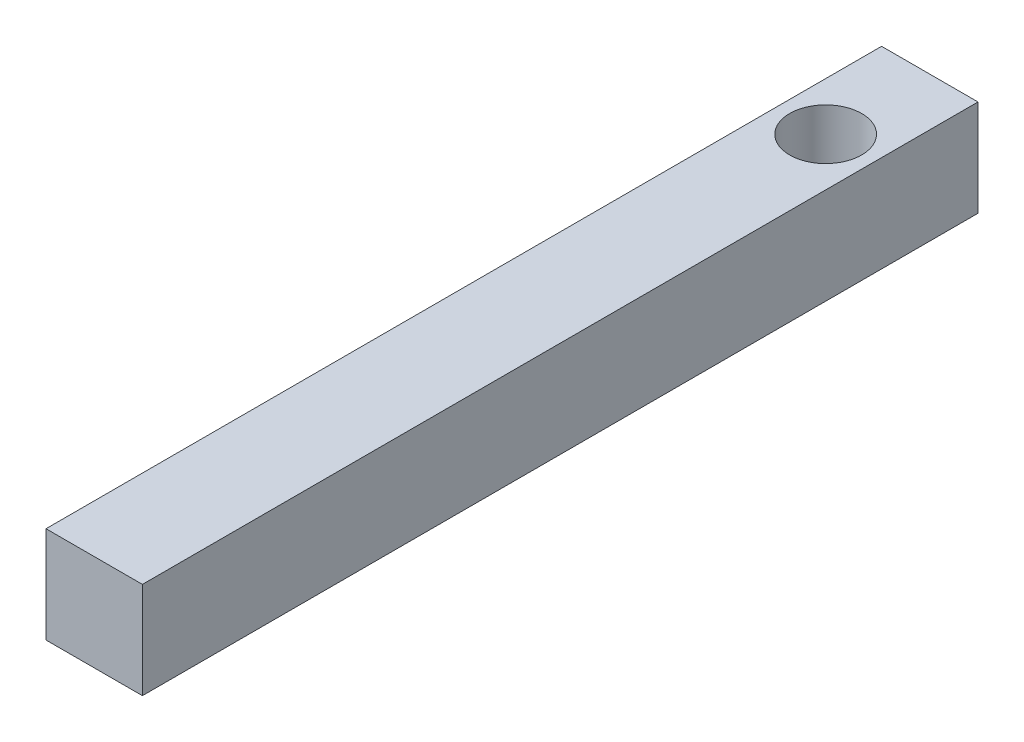
ISO-10303-21;
HEADER;
FILE_DESCRIPTION(('STEP AP214'),'2;1');
FILE_NAME('part.step','',(''),(''),'','','');
FILE_SCHEMA(('AUTOMOTIVE_DESIGN { 1 0 10303 214 1 1 1 1 }'));
ENDSEC;
DATA;
#1=APPLICATION_CONTEXT('core data for automotive mechanical design processes');
#2=APPLICATION_PROTOCOL_DEFINITION('international standard','automotive_design',2000,#1);
#3=PRODUCT_CONTEXT('',#1,'mechanical');
#4=PRODUCT('Part','Part','',(#3));
#5=PRODUCT_RELATED_PRODUCT_CATEGORY('part','',(#4));
#6=PRODUCT_DEFINITION_FORMATION('','',#4);
#7=PRODUCT_DEFINITION_CONTEXT('part definition',#1,'design');
#8=PRODUCT_DEFINITION('design','',#6,#7);
#9=PRODUCT_DEFINITION_SHAPE('','',#8);
#10=(LENGTH_UNIT() NAMED_UNIT(*) SI_UNIT(.MILLI.,.METRE.));
#11=(NAMED_UNIT(*) PLANE_ANGLE_UNIT() SI_UNIT($,.RADIAN.));
#12=(NAMED_UNIT(*) SI_UNIT($,.STERADIAN.) SOLID_ANGLE_UNIT());
#13=UNCERTAINTY_MEASURE_WITH_UNIT(LENGTH_MEASURE(1.E-05),#10,'distance_accuracy_value','');
#14=(GEOMETRIC_REPRESENTATION_CONTEXT(3) GLOBAL_UNCERTAINTY_ASSIGNED_CONTEXT((#13)) GLOBAL_UNIT_ASSIGNED_CONTEXT((#10,
#11,#12)) REPRESENTATION_CONTEXT('',''));
#15=CARTESIAN_POINT('',(0.,0.,0.));
#16=DIRECTION('',(0.,0.,1.));
#17=DIRECTION('',(1.,0.,0.));
#18=AXIS2_PLACEMENT_3D('',#15,#16,#17);
#19=CARTESIAN_POINT('',(0.,0.,165.1));
#20=DIRECTION('',(1.,0.,0.));
#21=DIRECTION('',(0.,0.,-1.));
#22=AXIS2_PLACEMENT_3D('',#19,#20,#21);
#23=PLANE('',#22);
#24=DIRECTION('',(0.,-1.,0.));
#25=VECTOR('',#24,1.);
#26=CARTESIAN_POINT('',(0.,0.,0.));
#27=LINE('',#26,#25);
#28=CARTESIAN_POINT('',(0.,19.05,0.));
#29=VERTEX_POINT('',#28);
#30=CARTESIAN_POINT('',(0.,0.,0.));
#31=VERTEX_POINT('',#30);
#32=EDGE_CURVE('E96',#29,#31,#27,.T.);
#33=ORIENTED_EDGE('',*,*,#32,.T.);
#34=DIRECTION('',(0.,0.,-1.));
#35=VECTOR('',#34,1.);
#36=CARTESIAN_POINT('',(0.,0.,165.1));
#37=LINE('',#36,#35);
#38=CARTESIAN_POINT('',(0.,0.,165.1));
#39=VERTEX_POINT('',#38);
#40=EDGE_CURVE('E11',#39,#31,#37,.T.);
#41=ORIENTED_EDGE('',*,*,#40,.F.);
#42=DIRECTION('',(0.,-1.,0.));
#43=VECTOR('',#42,1.);
#44=CARTESIAN_POINT('',(0.,0.,165.1));
#45=LINE('',#44,#43);
#46=CARTESIAN_POINT('',(0.,19.05,165.1));
#47=VERTEX_POINT('',#46);
#48=EDGE_CURVE('E84',#47,#39,#45,.T.);
#49=ORIENTED_EDGE('',*,*,#48,.F.);
#50=DIRECTION('',(0.,0.,-1.));
#51=VECTOR('',#50,1.);
#52=CARTESIAN_POINT('',(0.,19.05,165.1));
#53=LINE('',#52,#51);
#54=EDGE_CURVE('E92',#47,#29,#53,.T.);
#55=ORIENTED_EDGE('',*,*,#54,.T.);
#56=EDGE_LOOP('',(#33,#41,#49,#55));
#57=FACE_BOUND('',#56,.T.);
#58=ADVANCED_FACE('F33',(#57),#23,.F.);
#59=CARTESIAN_POINT('',(0.,0.,165.1));
#60=DIRECTION('',(0.,1.,0.));
#61=DIRECTION('',(0.,0.,1.));
#62=AXIS2_PLACEMENT_3D('',#59,#60,#61);
#63=PLANE('',#62);
#64=CARTESIAN_POINT('',(9.525,0.,20.574));
#65=DIRECTION('',(0.,1.,0.));
#66=DIRECTION('',(0.,0.,1.));
#67=AXIS2_PLACEMENT_3D('',#64,#65,#66);
#68=CIRCLE('',#67,7.112);
#69=CARTESIAN_POINT('',(9.525,0.,27.686));
#70=VERTEX_POINT('',#69);
#71=EDGE_CURVE('E99',#70,#70,#68,.T.);
#72=ORIENTED_EDGE('',*,*,#71,.T.);
#73=EDGE_LOOP('',(#72));
#74=FACE_BOUND('',#73,.T.);
#75=DIRECTION('',(1.,0.,0.));
#76=VECTOR('',#75,1.);
#77=CARTESIAN_POINT('',(0.,0.,0.));
#78=LINE('',#77,#76);
#79=CARTESIAN_POINT('',(19.05,0.,0.));
#80=VERTEX_POINT('',#79);
#81=EDGE_CURVE('E88',#31,#80,#78,.T.);
#82=ORIENTED_EDGE('',*,*,#81,.T.);
#83=DIRECTION('',(0.,0.,-1.));
#84=VECTOR('',#83,1.);
#85=CARTESIAN_POINT('',(19.05,0.,165.1));
#86=LINE('',#85,#84);
#87=CARTESIAN_POINT('',(19.05,0.,165.1));
#88=VERTEX_POINT('',#87);
#89=EDGE_CURVE('E41',#88,#80,#86,.T.);
#90=ORIENTED_EDGE('',*,*,#89,.F.);
#91=DIRECTION('',(1.,0.,0.));
#92=VECTOR('',#91,1.);
#93=CARTESIAN_POINT('',(0.,0.,165.1));
#94=LINE('',#93,#92);
#95=EDGE_CURVE('E79',#39,#88,#94,.T.);
#96=ORIENTED_EDGE('',*,*,#95,.F.);
#97=ORIENTED_EDGE('',*,*,#40,.T.);
#98=EDGE_LOOP('',(#82,#90,#96,#97));
#99=FACE_BOUND('',#98,.T.);
#100=ADVANCED_FACE('F87',(#74,#99),#63,.F.);
#101=CARTESIAN_POINT('',(19.05,0.,165.1));
#102=DIRECTION('',(-1.,0.,0.));
#103=DIRECTION('',(0.,0.,1.));
#104=AXIS2_PLACEMENT_3D('',#101,#102,#103);
#105=PLANE('',#104);
#106=DIRECTION('',(0.,1.,0.));
#107=VECTOR('',#106,1.);
#108=CARTESIAN_POINT('',(19.05,0.,0.));
#109=LINE('',#108,#107);
#110=CARTESIAN_POINT('',(19.05,19.05,0.));
#111=VERTEX_POINT('',#110);
#112=EDGE_CURVE('E66',#80,#111,#109,.T.);
#113=ORIENTED_EDGE('',*,*,#112,.T.);
#114=DIRECTION('',(0.,0.,-1.));
#115=VECTOR('',#114,1.);
#116=CARTESIAN_POINT('',(19.05,19.05,165.1));
#117=LINE('',#116,#115);
#118=CARTESIAN_POINT('',(19.05,19.05,165.1));
#119=VERTEX_POINT('',#118);
#120=EDGE_CURVE('E89',#119,#111,#117,.T.);
#121=ORIENTED_EDGE('',*,*,#120,.F.);
#122=DIRECTION('',(0.,1.,0.));
#123=VECTOR('',#122,1.);
#124=CARTESIAN_POINT('',(19.05,0.,165.1));
#125=LINE('',#124,#123);
#126=EDGE_CURVE('E82',#88,#119,#125,.T.);
#127=ORIENTED_EDGE('',*,*,#126,.F.);
#128=ORIENTED_EDGE('',*,*,#89,.T.);
#129=EDGE_LOOP('',(#113,#121,#127,#128));
#130=FACE_BOUND('',#129,.T.);
#131=ADVANCED_FACE('F90',(#130),#105,.F.);
#132=CARTESIAN_POINT('',(0.,19.05,165.1));
#133=DIRECTION('',(0.,-1.,0.));
#134=DIRECTION('',(0.,0.,-1.));
#135=AXIS2_PLACEMENT_3D('',#132,#133,#134);
#136=PLANE('',#135);
#137=CARTESIAN_POINT('',(9.525,19.05,20.574));
#138=DIRECTION('',(0.,1.,0.));
#139=DIRECTION('',(0.,0.,1.));
#140=AXIS2_PLACEMENT_3D('',#137,#138,#139);
#141=CIRCLE('',#140,7.112);
#142=CARTESIAN_POINT('',(9.525,19.05,27.686));
#143=VERTEX_POINT('',#142);
#144=EDGE_CURVE('E110',#143,#143,#141,.T.);
#145=ORIENTED_EDGE('',*,*,#144,.F.);
#146=EDGE_LOOP('',(#145));
#147=FACE_BOUND('',#146,.T.);
#148=DIRECTION('',(-1.,0.,0.));
#149=VECTOR('',#148,1.);
#150=CARTESIAN_POINT('',(0.,19.05,0.));
#151=LINE('',#150,#149);
#152=EDGE_CURVE('E72',#111,#29,#151,.T.);
#153=ORIENTED_EDGE('',*,*,#152,.T.);
#154=ORIENTED_EDGE('',*,*,#54,.F.);
#155=DIRECTION('',(-1.,0.,0.));
#156=VECTOR('',#155,1.);
#157=CARTESIAN_POINT('',(0.,19.05,165.1));
#158=LINE('',#157,#156);
#159=EDGE_CURVE('E49',#119,#47,#158,.T.);
#160=ORIENTED_EDGE('',*,*,#159,.F.);
#161=ORIENTED_EDGE('',*,*,#120,.T.);
#162=EDGE_LOOP('',(#153,#154,#160,#161));
#163=FACE_BOUND('',#162,.T.);
#164=ADVANCED_FACE('F104',(#147,#163),#136,.F.);
#165=CARTESIAN_POINT('',(0.,0.,165.1));
#166=DIRECTION('',(0.,0.,-1.));
#167=DIRECTION('',(-1.,0.,0.));
#168=AXIS2_PLACEMENT_3D('',#165,#166,#167);
#169=PLANE('',#168);
#170=ORIENTED_EDGE('',*,*,#48,.T.);
#171=ORIENTED_EDGE('',*,*,#95,.T.);
#172=ORIENTED_EDGE('',*,*,#126,.T.);
#173=ORIENTED_EDGE('',*,*,#159,.T.);
#174=EDGE_LOOP('',(#170,#171,#172,#173));
#175=FACE_BOUND('',#174,.T.);
#176=ADVANCED_FACE('F80',(#175),#169,.F.);
#177=CARTESIAN_POINT('',(0.,0.,0.));
#178=DIRECTION('',(0.,0.,-1.));
#179=DIRECTION('',(-1.,0.,0.));
#180=AXIS2_PLACEMENT_3D('',#177,#178,#179);
#181=PLANE('',#180);
#182=ORIENTED_EDGE('',*,*,#32,.F.);
#183=ORIENTED_EDGE('',*,*,#152,.F.);
#184=ORIENTED_EDGE('',*,*,#112,.F.);
#185=ORIENTED_EDGE('',*,*,#81,.F.);
#186=EDGE_LOOP('',(#182,#183,#184,#185));
#187=FACE_BOUND('',#186,.T.);
#188=ADVANCED_FACE('F107',(#187),#181,.T.);
#189=CARTESIAN_POINT('',(9.525,0.,20.574));
#190=DIRECTION('',(0.,1.,0.));
#191=DIRECTION('',(0.,0.,1.));
#192=AXIS2_PLACEMENT_3D('',#189,#190,#191);
#193=CYLINDRICAL_SURFACE('',#192,7.112);
#194=CARTESIAN_POINT('',(9.525,0.,27.686));
#195=CARTESIAN_POINT('',(9.525,0.1984375,27.686));
#196=CARTESIAN_POINT('',(9.525,0.396875,27.686));
#197=CARTESIAN_POINT('',(9.525,0.79375,27.686));
#198=CARTESIAN_POINT('',(9.525,0.9921875,27.686));
#199=CARTESIAN_POINT('',(9.525,1.3890625,27.686));
#200=CARTESIAN_POINT('',(9.525,1.5875,27.686));
#201=CARTESIAN_POINT('',(9.525,1.984375,27.686));
#202=CARTESIAN_POINT('',(9.525,2.1828125,27.686));
#203=CARTESIAN_POINT('',(9.525,2.5796875,27.686));
#204=CARTESIAN_POINT('',(9.525,2.778125,27.686));
#205=CARTESIAN_POINT('',(9.525,3.175,27.686));
#206=CARTESIAN_POINT('',(9.525,3.3734375,27.686));
#207=CARTESIAN_POINT('',(9.525,3.7703125,27.686));
#208=CARTESIAN_POINT('',(9.525,3.96875,27.686));
#209=CARTESIAN_POINT('',(9.525,4.365625,27.686));
#210=CARTESIAN_POINT('',(9.525,4.5640625,27.686));
#211=CARTESIAN_POINT('',(9.525,4.9609375,27.686));
#212=CARTESIAN_POINT('',(9.525,5.159375,27.686));
#213=CARTESIAN_POINT('',(9.525,5.55625,27.686));
#214=CARTESIAN_POINT('',(9.525,5.7546875,27.686));
#215=CARTESIAN_POINT('',(9.525,6.1515625,27.686));
#216=CARTESIAN_POINT('',(9.525,6.35,27.686));
#217=CARTESIAN_POINT('',(9.525,6.746875,27.686));
#218=CARTESIAN_POINT('',(9.525,6.9453125,27.686));
#219=CARTESIAN_POINT('',(9.525,7.3421875,27.686));
#220=CARTESIAN_POINT('',(9.525,7.540625,27.686));
#221=CARTESIAN_POINT('',(9.525,7.9375,27.686));
#222=CARTESIAN_POINT('',(9.525,8.1359375,27.686));
#223=CARTESIAN_POINT('',(9.525,8.5328125,27.686));
#224=CARTESIAN_POINT('',(9.525,8.73125,27.686));
#225=CARTESIAN_POINT('',(9.525,9.128125,27.686));
#226=CARTESIAN_POINT('',(9.525,9.3265625,27.686));
#227=CARTESIAN_POINT('',(9.525,9.7234375,27.686));
#228=CARTESIAN_POINT('',(9.525,9.921875,27.686));
#229=CARTESIAN_POINT('',(9.525,10.31875,27.686));
#230=CARTESIAN_POINT('',(9.525,10.5171875,27.686));
#231=CARTESIAN_POINT('',(9.525,10.9140625,27.686));
#232=CARTESIAN_POINT('',(9.525,11.1125,27.686));
#233=CARTESIAN_POINT('',(9.525,11.509375,27.686));
#234=CARTESIAN_POINT('',(9.525,11.7078125,27.686));
#235=CARTESIAN_POINT('',(9.525,12.1046875,27.686));
#236=CARTESIAN_POINT('',(9.525,12.303125,27.686));
#237=CARTESIAN_POINT('',(9.525,12.7,27.686));
#238=CARTESIAN_POINT('',(9.525,12.8984375,27.686));
#239=CARTESIAN_POINT('',(9.525,13.2953125,27.686));
#240=CARTESIAN_POINT('',(9.525,13.49375,27.686));
#241=CARTESIAN_POINT('',(9.525,13.890625,27.686));
#242=CARTESIAN_POINT('',(9.525,14.0890625,27.686));
#243=CARTESIAN_POINT('',(9.525,14.4859375,27.686));
#244=CARTESIAN_POINT('',(9.525,14.684375,27.686));
#245=CARTESIAN_POINT('',(9.525,15.08125,27.686));
#246=CARTESIAN_POINT('',(9.525,15.2796875,27.686));
#247=CARTESIAN_POINT('',(9.525,15.6765625,27.686));
#248=CARTESIAN_POINT('',(9.525,15.875,27.686));
#249=CARTESIAN_POINT('',(9.525,16.271875,27.686));
#250=CARTESIAN_POINT('',(9.525,16.4703125,27.686));
#251=CARTESIAN_POINT('',(9.525,16.8671875,27.686));
#252=CARTESIAN_POINT('',(9.525,17.065625,27.686));
#253=CARTESIAN_POINT('',(9.525,17.4625,27.686));
#254=CARTESIAN_POINT('',(9.525,17.6609375,27.686));
#255=CARTESIAN_POINT('',(9.525,18.0578125,27.686));
#256=CARTESIAN_POINT('',(9.525,18.25625,27.686));
#257=CARTESIAN_POINT('',(9.525,18.653125,27.686));
#258=CARTESIAN_POINT('',(9.525,18.8515625,27.686));
#259=CARTESIAN_POINT('',(9.525,19.05,27.686));
#260=B_SPLINE_CURVE_WITH_KNOTS('',3,(#194,#195,#196,#197,#198,#199,#200,#201,#202,#203,#204,
#205,#206,#207,#208,#209,#210,#211,#212,#213,#214,#215,#216,#217,#218,#219,#220,#221,#222,#223,
#224,#225,#226,#227,#228,#229,#230,#231,#232,#233,#234,#235,#236,#237,#238,#239,#240,#241,#242,
#243,#244,#245,#246,#247,#248,#249,#250,#251,#252,#253,#254,#255,#256,#257,#258,#259),
.UNSPECIFIED.,.F.,.F.,(4,2,2,2,2,2,2,2,2,2,2,2,2,2,2,2,2,2,2,2,2,2,2,2,2,2,2,2,2,2,2,2,4),(0.,
0.5953125,1.190625,1.7859375,2.38125,2.9765625,3.571875,4.1671875,4.7625,5.3578125,5.953125,
6.5484375,7.14375,7.7390625,8.334375,8.9296875,9.525,10.1203125,10.715625,11.3109375,11.90625,
12.5015625,13.096875,13.6921875,14.2875,14.8828125,15.478125,16.0734375,16.66875,17.2640625,
17.859375,18.4546875,19.05),.UNSPECIFIED.);
#261=EDGE_CURVE('BSEAM117',#70,#143,#260,.T.);
#262=ORIENTED_EDGE('',*,*,#71,.F.);
#263=ORIENTED_EDGE('',*,*,#144,.T.);
#264=ORIENTED_EDGE('',*,*,#261,.T.);
#265=ORIENTED_EDGE('',*,*,#261,.F.);
#266=EDGE_LOOP('',(#262,#264,#263,#265));
#267=FACE_BOUND('',#266,.T.);
#268=ADVANCED_FACE('F117',(#267),#193,.F.);
#269=CLOSED_SHELL('',(#58,#100,#131,#164,#176,#188,#268));
#270=MANIFOLD_SOLID_BREP('B2',#269);
#271=ADVANCED_BREP_SHAPE_REPRESENTATION('',(#18,#270),#14);
#272=SHAPE_DEFINITION_REPRESENTATION(#9,#271);
ENDSEC;
END-ISO-10303-21;
